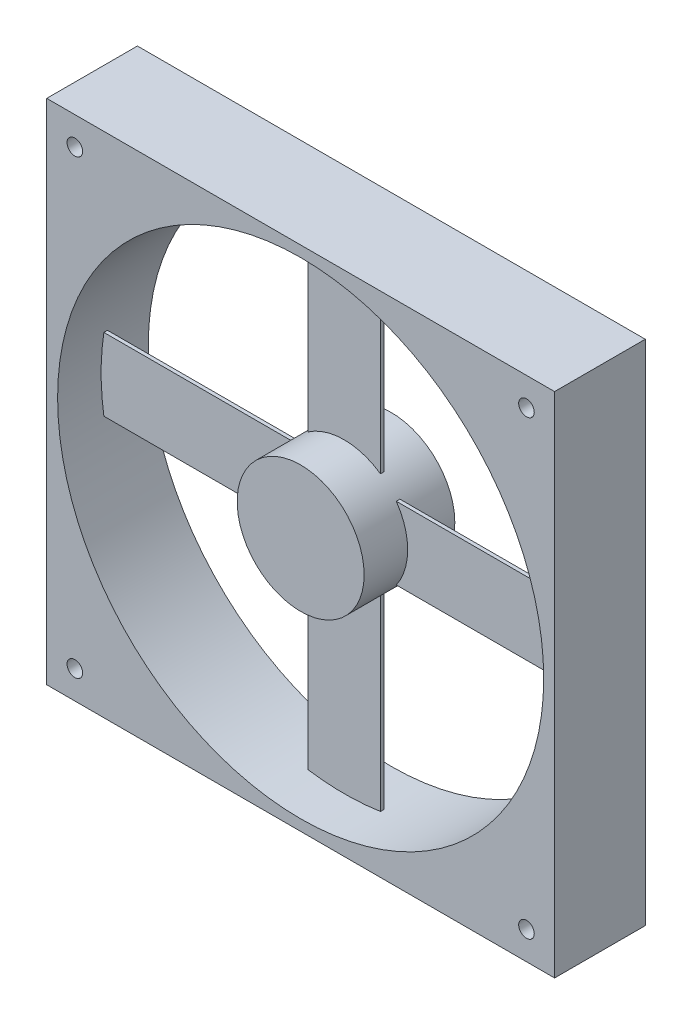
ISO-10303-21;
HEADER;
FILE_DESCRIPTION(('STEP AP214'),'2;1');
FILE_NAME('part.step','',(''),(''),'','','');
FILE_SCHEMA(('AUTOMOTIVE_DESIGN { 1 0 10303 214 1 1 1 1 }'));
ENDSEC;
DATA;
#1=APPLICATION_CONTEXT('core data for automotive mechanical design processes');
#2=APPLICATION_PROTOCOL_DEFINITION('international standard','automotive_design',2000,#1);
#3=PRODUCT_CONTEXT('',#1,'mechanical');
#4=PRODUCT('Part','Part','',(#3));
#5=PRODUCT_RELATED_PRODUCT_CATEGORY('part','',(#4));
#6=PRODUCT_DEFINITION_FORMATION('','',#4);
#7=PRODUCT_DEFINITION_CONTEXT('part definition',#1,'design');
#8=PRODUCT_DEFINITION('design','',#6,#7);
#9=PRODUCT_DEFINITION_SHAPE('','',#8);
#10=(LENGTH_UNIT() NAMED_UNIT(*) SI_UNIT(.MILLI.,.METRE.));
#11=(NAMED_UNIT(*) PLANE_ANGLE_UNIT() SI_UNIT($,.RADIAN.));
#12=(NAMED_UNIT(*) SI_UNIT($,.STERADIAN.) SOLID_ANGLE_UNIT());
#13=UNCERTAINTY_MEASURE_WITH_UNIT(LENGTH_MEASURE(1.E-05),#10,'distance_accuracy_value','');
#14=(GEOMETRIC_REPRESENTATION_CONTEXT(3) GLOBAL_UNCERTAINTY_ASSIGNED_CONTEXT((#13)) GLOBAL_UNIT_ASSIGNED_CONTEXT((#10,
#11,#12)) REPRESENTATION_CONTEXT('',''));
#15=CARTESIAN_POINT('',(0.,0.,0.));
#16=DIRECTION('',(0.,0.,1.));
#17=DIRECTION('',(1.,0.,0.));
#18=AXIS2_PLACEMENT_3D('',#15,#16,#17);
#19=CARTESIAN_POINT('',(0.,0.,12.));
#20=DIRECTION('',(0.,0.,-1.));
#21=DIRECTION('',(-1.,0.,0.));
#22=AXIS2_PLACEMENT_3D('',#19,#20,#21);
#23=PLANE('',#22);
#24=CARTESIAN_POINT('',(0.,0.,12.));
#25=DIRECTION('',(0.,0.,-1.));
#26=DIRECTION('',(-1.,0.,0.));
#27=AXIS2_PLACEMENT_3D('',#24,#25,#26);
#28=CIRCLE('',#27,17.5);
#29=CARTESIAN_POINT('',(-10.,14.3614066163451,12.));
#30=VERTEX_POINT('',#29);
#31=CARTESIAN_POINT('',(10.,14.3614066163451,12.));
#32=VERTEX_POINT('',#31);
#33=EDGE_CURVE('E429',#30,#32,#28,.T.);
#34=ORIENTED_EDGE('',*,*,#33,.F.);
#35=DIRECTION('',(0.,1.,0.));
#36=VECTOR('',#35,1.);
#37=CARTESIAN_POINT('',(-10.,66.2495283002075,12.));
#38=LINE('',#37,#36);
#39=CARTESIAN_POINT('',(-10.,66.2495283002075,12.));
#40=VERTEX_POINT('',#39);
#41=EDGE_CURVE('E418',#30,#40,#38,.T.);
#42=ORIENTED_EDGE('',*,*,#41,.T.);
#43=CARTESIAN_POINT('',(0.,0.,12.));
#44=DIRECTION('',(0.,0.,-1.));
#45=DIRECTION('',(-1.,0.,0.));
#46=AXIS2_PLACEMENT_3D('',#43,#44,#45);
#47=CIRCLE('',#46,67.);
#48=CARTESIAN_POINT('',(10.,66.2495283002075,12.));
#49=VERTEX_POINT('',#48);
#50=EDGE_CURVE('E421',#40,#49,#47,.T.);
#51=ORIENTED_EDGE('',*,*,#50,.T.);
#52=DIRECTION('',(0.,-1.,0.));
#53=VECTOR('',#52,1.);
#54=CARTESIAN_POINT('',(10.,66.2495283002075,12.));
#55=LINE('',#54,#53);
#56=EDGE_CURVE('E216',#49,#32,#55,.T.);
#57=ORIENTED_EDGE('',*,*,#56,.T.);
#58=EDGE_LOOP('',(#34,#42,#51,#57));
#59=FACE_BOUND('',#58,.T.);
#60=ADVANCED_FACE('F32',(#59),#23,.T.);
#61=CARTESIAN_POINT('',(14.3614066163451,10.,12.));
#62=VERTEX_POINT('',#61);
#63=CARTESIAN_POINT('',(14.3614066163451,-10.,12.));
#64=VERTEX_POINT('',#63);
#65=EDGE_CURVE('E396',#62,#64,#28,.T.);
#66=ORIENTED_EDGE('',*,*,#65,.F.);
#67=DIRECTION('',(1.,0.,0.));
#68=VECTOR('',#67,1.);
#69=CARTESIAN_POINT('',(66.2495283002075,10.,12.));
#70=LINE('',#69,#68);
#71=CARTESIAN_POINT('',(66.2495283002075,10.,12.));
#72=VERTEX_POINT('',#71);
#73=EDGE_CURVE('E211',#62,#72,#70,.T.);
#74=ORIENTED_EDGE('',*,*,#73,.T.);
#75=CARTESIAN_POINT('',(0.,0.,12.));
#76=DIRECTION('',(0.,0.,-1.));
#77=DIRECTION('',(-1.,0.,0.));
#78=AXIS2_PLACEMENT_3D('',#75,#76,#77);
#79=CIRCLE('',#78,67.);
#80=CARTESIAN_POINT('',(66.2495283002075,-10.,12.));
#81=VERTEX_POINT('',#80);
#82=EDGE_CURVE('E406',#72,#81,#79,.T.);
#83=ORIENTED_EDGE('',*,*,#82,.T.);
#84=DIRECTION('',(-1.,0.,0.));
#85=VECTOR('',#84,1.);
#86=CARTESIAN_POINT('',(66.2495283002075,-10.,12.));
#87=LINE('',#86,#85);
#88=EDGE_CURVE('E403',#81,#64,#87,.T.);
#89=ORIENTED_EDGE('',*,*,#88,.T.);
#90=EDGE_LOOP('',(#66,#74,#83,#89));
#91=FACE_BOUND('',#90,.T.);
#92=ADVANCED_FACE('F355',(#91),#23,.T.);
#93=CARTESIAN_POINT('',(9.99999999999999,-14.3614066163451,12.));
#94=VERTEX_POINT('',#93);
#95=CARTESIAN_POINT('',(-10.,-14.3614066163451,12.));
#96=VERTEX_POINT('',#95);
#97=EDGE_CURVE('E387',#94,#96,#28,.T.);
#98=ORIENTED_EDGE('',*,*,#97,.F.);
#99=DIRECTION('',(0.,-1.,0.));
#100=VECTOR('',#99,1.);
#101=CARTESIAN_POINT('',(10.,-14.3614066163451,12.));
#102=LINE('',#101,#100);
#103=CARTESIAN_POINT('',(10.,-66.2495283002075,12.));
#104=VERTEX_POINT('',#103);
#105=EDGE_CURVE('E390',#94,#104,#102,.T.);
#106=ORIENTED_EDGE('',*,*,#105,.T.);
#107=CARTESIAN_POINT('',(0.,0.,12.));
#108=DIRECTION('',(0.,0.,-1.));
#109=DIRECTION('',(-1.,0.,0.));
#110=AXIS2_PLACEMENT_3D('',#107,#108,#109);
#111=CIRCLE('',#110,67.);
#112=CARTESIAN_POINT('',(-10.,-66.2495283002075,12.));
#113=VERTEX_POINT('',#112);
#114=EDGE_CURVE('E48',#104,#113,#111,.T.);
#115=ORIENTED_EDGE('',*,*,#114,.T.);
#116=DIRECTION('',(0.,1.,0.));
#117=VECTOR('',#116,1.);
#118=CARTESIAN_POINT('',(-10.,-14.3614066163451,12.));
#119=LINE('',#118,#117);
#120=EDGE_CURVE('E393',#113,#96,#119,.T.);
#121=ORIENTED_EDGE('',*,*,#120,.T.);
#122=EDGE_LOOP('',(#98,#106,#115,#121));
#123=FACE_BOUND('',#122,.T.);
#124=ADVANCED_FACE('F362',(#123),#23,.T.);
#125=CARTESIAN_POINT('',(0.,0.,13.));
#126=DIRECTION('',(0.,0.,-1.));
#127=DIRECTION('',(-1.,0.,0.));
#128=AXIS2_PLACEMENT_3D('',#125,#126,#127);
#129=PLANE('',#128);
#130=DIRECTION('',(0.,1.,0.));
#131=VECTOR('',#130,1.);
#132=CARTESIAN_POINT('',(-10.,66.2495283002075,13.));
#133=LINE('',#132,#131);
#134=CARTESIAN_POINT('',(-10.,14.3614066163451,13.));
#135=VERTEX_POINT('',#134);
#136=CARTESIAN_POINT('',(-10.,66.2495283002075,13.));
#137=VERTEX_POINT('',#136);
#138=EDGE_CURVE('E203',#135,#137,#133,.T.);
#139=ORIENTED_EDGE('',*,*,#138,.F.);
#140=CARTESIAN_POINT('',(0.,0.,13.));
#141=DIRECTION('',(0.,0.,-1.));
#142=DIRECTION('',(-1.,0.,0.));
#143=AXIS2_PLACEMENT_3D('',#140,#141,#142);
#144=CIRCLE('',#143,17.5);
#145=CARTESIAN_POINT('',(10.,14.3614066163451,13.));
#146=VERTEX_POINT('',#145);
#147=EDGE_CURVE('E11',#135,#146,#144,.T.);
#148=ORIENTED_EDGE('',*,*,#147,.T.);
#149=DIRECTION('',(0.,-1.,0.));
#150=VECTOR('',#149,1.);
#151=CARTESIAN_POINT('',(10.,66.2495283002075,13.));
#152=LINE('',#151,#150);
#153=CARTESIAN_POINT('',(10.,66.2495283002075,13.));
#154=VERTEX_POINT('',#153);
#155=EDGE_CURVE('E208',#154,#146,#152,.T.);
#156=ORIENTED_EDGE('',*,*,#155,.F.);
#157=CARTESIAN_POINT('',(0.,0.,13.));
#158=DIRECTION('',(0.,0.,-1.));
#159=DIRECTION('',(-1.,0.,0.));
#160=AXIS2_PLACEMENT_3D('',#157,#158,#159);
#161=CIRCLE('',#160,67.);
#162=EDGE_CURVE('E206',#137,#154,#161,.T.);
#163=ORIENTED_EDGE('',*,*,#162,.F.);
#164=EDGE_LOOP('',(#139,#148,#156,#163));
#165=FACE_BOUND('',#164,.T.);
#166=ADVANCED_FACE('F374',(#165),#129,.F.);
#167=DIRECTION('',(1.,0.,0.));
#168=VECTOR('',#167,1.);
#169=CARTESIAN_POINT('',(66.2495283002075,10.,13.));
#170=LINE('',#169,#168);
#171=CARTESIAN_POINT('',(14.3614066163451,10.,13.));
#172=VERTEX_POINT('',#171);
#173=CARTESIAN_POINT('',(66.2495283002075,10.,13.));
#174=VERTEX_POINT('',#173);
#175=EDGE_CURVE('E425',#172,#174,#170,.T.);
#176=ORIENTED_EDGE('',*,*,#175,.F.);
#177=CARTESIAN_POINT('',(14.3614066163451,-10.,13.));
#178=VERTEX_POINT('',#177);
#179=EDGE_CURVE('E41',#172,#178,#144,.T.);
#180=ORIENTED_EDGE('',*,*,#179,.T.);
#181=DIRECTION('',(-1.,0.,0.));
#182=VECTOR('',#181,1.);
#183=CARTESIAN_POINT('',(66.2495283002075,-10.,13.));
#184=LINE('',#183,#182);
#185=CARTESIAN_POINT('',(66.2495283002075,-10.,13.));
#186=VERTEX_POINT('',#185);
#187=EDGE_CURVE('E431',#186,#178,#184,.T.);
#188=ORIENTED_EDGE('',*,*,#187,.F.);
#189=CARTESIAN_POINT('',(0.,0.,13.));
#190=DIRECTION('',(0.,0.,-1.));
#191=DIRECTION('',(-1.,0.,0.));
#192=AXIS2_PLACEMENT_3D('',#189,#190,#191);
#193=CIRCLE('',#192,67.);
#194=EDGE_CURVE('E428',#174,#186,#193,.T.);
#195=ORIENTED_EDGE('',*,*,#194,.F.);
#196=EDGE_LOOP('',(#176,#180,#188,#195));
#197=FACE_BOUND('',#196,.T.);
#198=ADVANCED_FACE('F384',(#197),#129,.F.);
#199=DIRECTION('',(0.,-1.,0.));
#200=VECTOR('',#199,1.);
#201=CARTESIAN_POINT('',(10.,-14.3614066163451,13.));
#202=LINE('',#201,#200);
#203=CARTESIAN_POINT('',(10.,-14.3614066163451,13.));
#204=VERTEX_POINT('',#203);
#205=CARTESIAN_POINT('',(10.,-66.2495283002075,13.));
#206=VERTEX_POINT('',#205);
#207=EDGE_CURVE('E434',#204,#206,#202,.T.);
#208=ORIENTED_EDGE('',*,*,#207,.F.);
#209=CARTESIAN_POINT('',(-10.,-14.3614066163451,13.));
#210=VERTEX_POINT('',#209);
#211=EDGE_CURVE('E178',#204,#210,#144,.T.);
#212=ORIENTED_EDGE('',*,*,#211,.T.);
#213=DIRECTION('',(0.,1.,0.));
#214=VECTOR('',#213,1.);
#215=CARTESIAN_POINT('',(-10.,-14.3614066163451,13.));
#216=LINE('',#215,#214);
#217=CARTESIAN_POINT('',(-10.,-66.2495283002075,13.));
#218=VERTEX_POINT('',#217);
#219=EDGE_CURVE('E193',#218,#210,#216,.T.);
#220=ORIENTED_EDGE('',*,*,#219,.F.);
#221=CARTESIAN_POINT('',(0.,0.,13.));
#222=DIRECTION('',(0.,0.,-1.));
#223=DIRECTION('',(-1.,0.,0.));
#224=AXIS2_PLACEMENT_3D('',#221,#222,#223);
#225=CIRCLE('',#224,67.);
#226=EDGE_CURVE('E198',#206,#218,#225,.T.);
#227=ORIENTED_EDGE('',*,*,#226,.F.);
#228=EDGE_LOOP('',(#208,#212,#220,#227));
#229=FACE_BOUND('',#228,.T.);
#230=ADVANCED_FACE('F375',(#229),#129,.F.);
#231=CARTESIAN_POINT('',(-70.,70.,25.));
#232=DIRECTION('',(1.,0.,0.));
#233=DIRECTION('',(0.,1.,0.));
#234=AXIS2_PLACEMENT_3D('',#231,#232,#233);
#235=PLANE('',#234);
#236=DIRECTION('',(0.,-1.,0.));
#237=VECTOR('',#236,1.);
#238=CARTESIAN_POINT('',(-70.,70.,0.));
#239=LINE('',#238,#237);
#240=CARTESIAN_POINT('',(-70.,70.,0.));
#241=VERTEX_POINT('',#240);
#242=CARTESIAN_POINT('',(-70.,-70.,0.));
#243=VERTEX_POINT('',#242);
#244=EDGE_CURVE('E248',#241,#243,#239,.T.);
#245=ORIENTED_EDGE('',*,*,#244,.T.);
#246=DIRECTION('',(0.,0.,-1.));
#247=VECTOR('',#246,1.);
#248=CARTESIAN_POINT('',(-70.,-70.,25.));
#249=LINE('',#248,#247);
#250=CARTESIAN_POINT('',(-70.,-70.,25.));
#251=VERTEX_POINT('',#250);
#252=EDGE_CURVE('E249',#251,#243,#249,.T.);
#253=ORIENTED_EDGE('',*,*,#252,.F.);
#254=DIRECTION('',(0.,-1.,0.));
#255=VECTOR('',#254,1.);
#256=CARTESIAN_POINT('',(-70.,70.,25.));
#257=LINE('',#256,#255);
#258=CARTESIAN_POINT('',(-70.,70.,25.));
#259=VERTEX_POINT('',#258);
#260=EDGE_CURVE('E261',#259,#251,#257,.T.);
#261=ORIENTED_EDGE('',*,*,#260,.F.);
#262=DIRECTION('',(0.,0.,-1.));
#263=VECTOR('',#262,1.);
#264=CARTESIAN_POINT('',(-70.,70.,25.));
#265=LINE('',#264,#263);
#266=EDGE_CURVE('E262',#259,#241,#265,.T.);
#267=ORIENTED_EDGE('',*,*,#266,.T.);
#268=EDGE_LOOP('',(#245,#253,#261,#267));
#269=FACE_BOUND('',#268,.T.);
#270=ADVANCED_FACE('F334',(#269),#235,.F.);
#271=CARTESIAN_POINT('',(-70.,-70.,25.));
#272=DIRECTION('',(0.,1.,0.));
#273=DIRECTION('',(0.,0.,1.));
#274=AXIS2_PLACEMENT_3D('',#271,#272,#273);
#275=PLANE('',#274);
#276=DIRECTION('',(1.,0.,0.));
#277=VECTOR('',#276,1.);
#278=CARTESIAN_POINT('',(-70.,-70.,0.));
#279=LINE('',#278,#277);
#280=CARTESIAN_POINT('',(70.,-70.,0.));
#281=VERTEX_POINT('',#280);
#282=EDGE_CURVE('E253',#243,#281,#279,.T.);
#283=ORIENTED_EDGE('',*,*,#282,.T.);
#284=DIRECTION('',(0.,0.,-1.));
#285=VECTOR('',#284,1.);
#286=CARTESIAN_POINT('',(70.,-70.,25.));
#287=LINE('',#286,#285);
#288=CARTESIAN_POINT('',(70.,-70.,25.));
#289=VERTEX_POINT('',#288);
#290=EDGE_CURVE('E254',#289,#281,#287,.T.);
#291=ORIENTED_EDGE('',*,*,#290,.F.);
#292=DIRECTION('',(1.,0.,0.));
#293=VECTOR('',#292,1.);
#294=CARTESIAN_POINT('',(-70.,-70.,25.));
#295=LINE('',#294,#293);
#296=EDGE_CURVE('E275',#251,#289,#295,.T.);
#297=ORIENTED_EDGE('',*,*,#296,.F.);
#298=ORIENTED_EDGE('',*,*,#252,.T.);
#299=EDGE_LOOP('',(#283,#291,#297,#298));
#300=FACE_BOUND('',#299,.T.);
#301=ADVANCED_FACE('F337',(#300),#275,.F.);
#302=CARTESIAN_POINT('',(70.,70.,25.));
#303=DIRECTION('',(-1.,0.,0.));
#304=DIRECTION('',(0.,-1.,0.));
#305=AXIS2_PLACEMENT_3D('',#302,#303,#304);
#306=PLANE('',#305);
#307=DIRECTION('',(0.,1.,0.));
#308=VECTOR('',#307,1.);
#309=CARTESIAN_POINT('',(70.,70.,0.));
#310=LINE('',#309,#308);
#311=CARTESIAN_POINT('',(70.,70.,0.));
#312=VERTEX_POINT('',#311);
#313=EDGE_CURVE('E252',#281,#312,#310,.T.);
#314=ORIENTED_EDGE('',*,*,#313,.T.);
#315=DIRECTION('',(0.,0.,-1.));
#316=VECTOR('',#315,1.);
#317=CARTESIAN_POINT('',(70.,70.,25.));
#318=LINE('',#317,#316);
#319=CARTESIAN_POINT('',(70.,70.,25.));
#320=VERTEX_POINT('',#319);
#321=EDGE_CURVE('E258',#320,#312,#318,.T.);
#322=ORIENTED_EDGE('',*,*,#321,.F.);
#323=DIRECTION('',(0.,1.,0.));
#324=VECTOR('',#323,1.);
#325=CARTESIAN_POINT('',(70.,70.,25.));
#326=LINE('',#325,#324);
#327=EDGE_CURVE('E273',#289,#320,#326,.T.);
#328=ORIENTED_EDGE('',*,*,#327,.F.);
#329=ORIENTED_EDGE('',*,*,#290,.T.);
#330=EDGE_LOOP('',(#314,#322,#328,#329));
#331=FACE_BOUND('',#330,.T.);
#332=ADVANCED_FACE('F342',(#331),#306,.F.);
#333=CARTESIAN_POINT('',(-70.,70.,25.));
#334=DIRECTION('',(0.,-1.,0.));
#335=DIRECTION('',(0.,0.,-1.));
#336=AXIS2_PLACEMENT_3D('',#333,#334,#335);
#337=PLANE('',#336);
#338=DIRECTION('',(-1.,0.,0.));
#339=VECTOR('',#338,1.);
#340=CARTESIAN_POINT('',(-70.,70.,0.));
#341=LINE('',#340,#339);
#342=EDGE_CURVE('E257',#312,#241,#341,.T.);
#343=ORIENTED_EDGE('',*,*,#342,.T.);
#344=ORIENTED_EDGE('',*,*,#266,.F.);
#345=DIRECTION('',(-1.,0.,0.));
#346=VECTOR('',#345,1.);
#347=CARTESIAN_POINT('',(-70.,70.,25.));
#348=LINE('',#347,#346);
#349=EDGE_CURVE('E270',#320,#259,#348,.T.);
#350=ORIENTED_EDGE('',*,*,#349,.F.);
#351=ORIENTED_EDGE('',*,*,#321,.T.);
#352=EDGE_LOOP('',(#343,#344,#350,#351));
#353=FACE_BOUND('',#352,.T.);
#354=ADVANCED_FACE('F319',(#353),#337,.F.);
#355=CARTESIAN_POINT('',(-70.,-70.,25.));
#356=DIRECTION('',(0.,0.,1.));
#357=DIRECTION('',(1.,0.,0.));
#358=AXIS2_PLACEMENT_3D('',#355,#356,#357);
#359=PLANE('',#358);
#360=CARTESIAN_POINT('',(0.,0.,25.));
#361=DIRECTION('',(0.,0.,1.));
#362=DIRECTION('',(1.,0.,0.));
#363=AXIS2_PLACEMENT_3D('',#360,#361,#362);
#364=CIRCLE('',#363,67.);
#365=CARTESIAN_POINT('',(67.,0.,25.));
#366=VERTEX_POINT('',#365);
#367=EDGE_CURVE('E179',#366,#366,#364,.T.);
#368=ORIENTED_EDGE('',*,*,#367,.F.);
#369=EDGE_LOOP('',(#368));
#370=FACE_BOUND('',#369,.T.);
#371=CARTESIAN_POINT('',(62.2499999999998,62.25,25.));
#372=DIRECTION('',(0.,0.,1.));
#373=DIRECTION('',(1.,0.,0.));
#374=AXIS2_PLACEMENT_3D('',#371,#372,#373);
#375=CIRCLE('',#374,2.15000000000001);
#376=CARTESIAN_POINT('',(64.3999999999998,62.25,25.));
#377=VERTEX_POINT('',#376);
#378=EDGE_CURVE('E295',#377,#377,#375,.T.);
#379=ORIENTED_EDGE('',*,*,#378,.F.);
#380=EDGE_LOOP('',(#379));
#381=FACE_BOUND('',#380,.T.);
#382=CARTESIAN_POINT('',(62.2499999999998,-62.25,25.));
#383=DIRECTION('',(0.,0.,1.));
#384=DIRECTION('',(1.,0.,0.));
#385=AXIS2_PLACEMENT_3D('',#382,#383,#384);
#386=CIRCLE('',#385,2.15000000000001);
#387=CARTESIAN_POINT('',(64.3999999999998,-62.25,25.));
#388=VERTEX_POINT('',#387);
#389=EDGE_CURVE('E289',#388,#388,#386,.T.);
#390=ORIENTED_EDGE('',*,*,#389,.F.);
#391=EDGE_LOOP('',(#390));
#392=FACE_BOUND('',#391,.T.);
#393=CARTESIAN_POINT('',(-62.2499999999998,-62.25,25.));
#394=DIRECTION('',(0.,0.,1.));
#395=DIRECTION('',(1.,0.,0.));
#396=AXIS2_PLACEMENT_3D('',#393,#394,#395);
#397=CIRCLE('',#396,2.15);
#398=CARTESIAN_POINT('',(-60.0999999999998,-62.25,25.));
#399=VERTEX_POINT('',#398);
#400=EDGE_CURVE('E282',#399,#399,#397,.T.);
#401=ORIENTED_EDGE('',*,*,#400,.F.);
#402=EDGE_LOOP('',(#401));
#403=FACE_BOUND('',#402,.T.);
#404=CARTESIAN_POINT('',(-62.2499999999998,62.25,25.));
#405=DIRECTION('',(0.,0.,1.));
#406=DIRECTION('',(1.,0.,0.));
#407=AXIS2_PLACEMENT_3D('',#404,#405,#406);
#408=CIRCLE('',#407,2.15);
#409=CARTESIAN_POINT('',(-60.0999999999998,62.25,25.));
#410=VERTEX_POINT('',#409);
#411=EDGE_CURVE('E279',#410,#410,#408,.T.);
#412=ORIENTED_EDGE('',*,*,#411,.F.);
#413=EDGE_LOOP('',(#412));
#414=FACE_BOUND('',#413,.T.);
#415=ORIENTED_EDGE('',*,*,#260,.T.);
#416=ORIENTED_EDGE('',*,*,#296,.T.);
#417=ORIENTED_EDGE('',*,*,#327,.T.);
#418=ORIENTED_EDGE('',*,*,#349,.T.);
#419=EDGE_LOOP('',(#415,#416,#417,#418));
#420=FACE_BOUND('',#419,.T.);
#421=ADVANCED_FACE('F34',(#370,#381,#392,#403,#414,#420),#359,.T.);
#422=CARTESIAN_POINT('',(-70.,-70.,0.));
#423=DIRECTION('',(0.,0.,1.));
#424=DIRECTION('',(1.,0.,0.));
#425=AXIS2_PLACEMENT_3D('',#422,#423,#424);
#426=PLANE('',#425);
#427=CARTESIAN_POINT('',(0.,0.,0.));
#428=DIRECTION('',(0.,0.,1.));
#429=DIRECTION('',(1.,0.,0.));
#430=AXIS2_PLACEMENT_3D('',#427,#428,#429);
#431=CIRCLE('',#430,67.);
#432=CARTESIAN_POINT('',(67.,0.,0.));
#433=VERTEX_POINT('',#432);
#434=EDGE_CURVE('E272',#433,#433,#431,.T.);
#435=ORIENTED_EDGE('',*,*,#434,.T.);
#436=EDGE_LOOP('',(#435));
#437=FACE_BOUND('',#436,.T.);
#438=CARTESIAN_POINT('',(62.2499999999998,62.25,0.));
#439=DIRECTION('',(0.,0.,1.));
#440=DIRECTION('',(1.,0.,0.));
#441=AXIS2_PLACEMENT_3D('',#438,#439,#440);
#442=CIRCLE('',#441,2.15000000000001);
#443=CARTESIAN_POINT('',(64.3999999999998,62.25,0.));
#444=VERTEX_POINT('',#443);
#445=EDGE_CURVE('E298',#444,#444,#442,.T.);
#446=ORIENTED_EDGE('',*,*,#445,.T.);
#447=EDGE_LOOP('',(#446));
#448=FACE_BOUND('',#447,.T.);
#449=CARTESIAN_POINT('',(62.2499999999998,-62.25,0.));
#450=DIRECTION('',(0.,0.,1.));
#451=DIRECTION('',(1.,0.,0.));
#452=AXIS2_PLACEMENT_3D('',#449,#450,#451);
#453=CIRCLE('',#452,2.15000000000001);
#454=CARTESIAN_POINT('',(64.3999999999998,-62.25,0.));
#455=VERTEX_POINT('',#454);
#456=EDGE_CURVE('E292',#455,#455,#453,.T.);
#457=ORIENTED_EDGE('',*,*,#456,.T.);
#458=EDGE_LOOP('',(#457));
#459=FACE_BOUND('',#458,.T.);
#460=CARTESIAN_POINT('',(-62.2499999999998,-62.25,0.));
#461=DIRECTION('',(0.,0.,1.));
#462=DIRECTION('',(1.,0.,0.));
#463=AXIS2_PLACEMENT_3D('',#460,#461,#462);
#464=CIRCLE('',#463,2.15);
#465=CARTESIAN_POINT('',(-60.0999999999998,-62.25,0.));
#466=VERTEX_POINT('',#465);
#467=EDGE_CURVE('E286',#466,#466,#464,.T.);
#468=ORIENTED_EDGE('',*,*,#467,.T.);
#469=EDGE_LOOP('',(#468));
#470=FACE_BOUND('',#469,.T.);
#471=CARTESIAN_POINT('',(-62.2499999999998,62.25,0.));
#472=DIRECTION('',(0.,0.,1.));
#473=DIRECTION('',(1.,0.,0.));
#474=AXIS2_PLACEMENT_3D('',#471,#472,#473);
#475=CIRCLE('',#474,2.15);
#476=CARTESIAN_POINT('',(-60.0999999999998,62.25,0.));
#477=VERTEX_POINT('',#476);
#478=EDGE_CURVE('E283',#477,#477,#475,.T.);
#479=ORIENTED_EDGE('',*,*,#478,.T.);
#480=EDGE_LOOP('',(#479));
#481=FACE_BOUND('',#480,.T.);
#482=ORIENTED_EDGE('',*,*,#244,.F.);
#483=ORIENTED_EDGE('',*,*,#342,.F.);
#484=ORIENTED_EDGE('',*,*,#313,.F.);
#485=ORIENTED_EDGE('',*,*,#282,.F.);
#486=EDGE_LOOP('',(#482,#483,#484,#485));
#487=FACE_BOUND('',#486,.T.);
#488=ADVANCED_FACE('F307',(#437,#448,#459,#470,#481,#487),#426,.F.);
#489=CARTESIAN_POINT('',(-62.2499999999998,62.25,0.));
#490=DIRECTION('',(0.,0.,1.));
#491=DIRECTION('',(1.,0.,0.));
#492=AXIS2_PLACEMENT_3D('',#489,#490,#491);
#493=CYLINDRICAL_SURFACE('',#492,2.15);
#494=ORIENTED_EDGE('',*,*,#478,.F.);
#495=EDGE_LOOP('',(#494));
#496=FACE_BOUND('',#495,.T.);
#497=ORIENTED_EDGE('',*,*,#411,.T.);
#498=EDGE_LOOP('',(#497));
#499=FACE_BOUND('',#498,.T.);
#500=ADVANCED_FACE('F347',(#496,#499),#493,.F.);
#501=CARTESIAN_POINT('',(-62.2499999999998,-62.25,0.));
#502=DIRECTION('',(0.,0.,1.));
#503=DIRECTION('',(1.,0.,0.));
#504=AXIS2_PLACEMENT_3D('',#501,#502,#503);
#505=CYLINDRICAL_SURFACE('',#504,2.15);
#506=ORIENTED_EDGE('',*,*,#467,.F.);
#507=EDGE_LOOP('',(#506));
#508=FACE_BOUND('',#507,.T.);
#509=ORIENTED_EDGE('',*,*,#400,.T.);
#510=EDGE_LOOP('',(#509));
#511=FACE_BOUND('',#510,.T.);
#512=ADVANCED_FACE('F351',(#508,#511),#505,.F.);
#513=CARTESIAN_POINT('',(62.2499999999998,-62.25,0.));
#514=DIRECTION('',(0.,0.,1.));
#515=DIRECTION('',(1.,0.,0.));
#516=AXIS2_PLACEMENT_3D('',#513,#514,#515);
#517=CYLINDRICAL_SURFACE('',#516,2.15000000000001);
#518=ORIENTED_EDGE('',*,*,#456,.F.);
#519=EDGE_LOOP('',(#518));
#520=FACE_BOUND('',#519,.T.);
#521=ORIENTED_EDGE('',*,*,#389,.T.);
#522=EDGE_LOOP('',(#521));
#523=FACE_BOUND('',#522,.T.);
#524=ADVANCED_FACE('F486',(#520,#523),#517,.F.);
#525=CARTESIAN_POINT('',(62.2499999999998,62.25,0.));
#526=DIRECTION('',(0.,0.,1.));
#527=DIRECTION('',(1.,0.,0.));
#528=AXIS2_PLACEMENT_3D('',#525,#526,#527);
#529=CYLINDRICAL_SURFACE('',#528,2.15000000000001);
#530=ORIENTED_EDGE('',*,*,#445,.F.);
#531=EDGE_LOOP('',(#530));
#532=FACE_BOUND('',#531,.T.);
#533=ORIENTED_EDGE('',*,*,#378,.T.);
#534=EDGE_LOOP('',(#533));
#535=FACE_BOUND('',#534,.T.);
#536=ADVANCED_FACE('F313',(#532,#535),#529,.F.);
#537=CARTESIAN_POINT('',(0.,0.,0.));
#538=DIRECTION('',(0.,0.,1.));
#539=DIRECTION('',(1.,0.,0.));
#540=AXIS2_PLACEMENT_3D('',#537,#538,#539);
#541=CYLINDRICAL_SURFACE('',#540,67.);
#542=DIRECTION('',(0.,0.,1.));
#543=VECTOR('',#542,1.);
#544=CARTESIAN_POINT('',(-9.99999999999999,-66.2495283002075,12.));
#545=LINE('',#544,#543);
#546=EDGE_CURVE('E53',#113,#218,#545,.T.);
#547=ORIENTED_EDGE('',*,*,#546,.F.);
#548=ORIENTED_EDGE('',*,*,#114,.F.);
#549=DIRECTION('',(0.,0.,1.));
#550=VECTOR('',#549,1.);
#551=CARTESIAN_POINT('',(10.,-66.2495283002075,12.));
#552=LINE('',#551,#550);
#553=EDGE_CURVE('E232',#104,#206,#552,.T.);
#554=ORIENTED_EDGE('',*,*,#553,.T.);
#555=ORIENTED_EDGE('',*,*,#226,.T.);
#556=EDGE_LOOP('',(#547,#548,#554,#555));
#557=FACE_BOUND('',#556,.T.);
#558=DIRECTION('',(0.,0.,1.));
#559=VECTOR('',#558,1.);
#560=CARTESIAN_POINT('',(66.2495283002075,-10.,12.));
#561=LINE('',#560,#559);
#562=EDGE_CURVE('E240',#81,#186,#561,.T.);
#563=ORIENTED_EDGE('',*,*,#562,.F.);
#564=ORIENTED_EDGE('',*,*,#82,.F.);
#565=DIRECTION('',(0.,0.,1.));
#566=VECTOR('',#565,1.);
#567=CARTESIAN_POINT('',(66.2495283002075,10.,12.));
#568=LINE('',#567,#566);
#569=EDGE_CURVE('E243',#72,#174,#568,.T.);
#570=ORIENTED_EDGE('',*,*,#569,.T.);
#571=ORIENTED_EDGE('',*,*,#194,.T.);
#572=EDGE_LOOP('',(#563,#564,#570,#571));
#573=FACE_BOUND('',#572,.T.);
#574=DIRECTION('',(0.,0.,1.));
#575=VECTOR('',#574,1.);
#576=CARTESIAN_POINT('',(10.,66.2495283002075,12.));
#577=LINE('',#576,#575);
#578=EDGE_CURVE('E215',#49,#154,#577,.T.);
#579=ORIENTED_EDGE('',*,*,#578,.F.);
#580=ORIENTED_EDGE('',*,*,#50,.F.);
#581=DIRECTION('',(0.,0.,1.));
#582=VECTOR('',#581,1.);
#583=CARTESIAN_POINT('',(-10.,66.2495283002075,12.));
#584=LINE('',#583,#582);
#585=EDGE_CURVE('E219',#40,#137,#584,.T.);
#586=ORIENTED_EDGE('',*,*,#585,.T.);
#587=ORIENTED_EDGE('',*,*,#162,.T.);
#588=EDGE_LOOP('',(#579,#580,#586,#587));
#589=FACE_BOUND('',#588,.T.);
#590=DIRECTION('',(0.,0.,1.));
#591=VECTOR('',#590,1.);
#592=CARTESIAN_POINT('',(-66.2495283002075,10.,12.));
#593=LINE('',#592,#591);
#594=CARTESIAN_POINT('',(-66.2495283002075,10.,12.));
#595=VERTEX_POINT('',#594);
#596=CARTESIAN_POINT('',(-66.2495283002075,10.,13.));
#597=VERTEX_POINT('',#596);
#598=EDGE_CURVE('E225',#595,#597,#593,.T.);
#599=ORIENTED_EDGE('',*,*,#598,.F.);
#600=CARTESIAN_POINT('',(0.,0.,12.));
#601=DIRECTION('',(0.,0.,-1.));
#602=DIRECTION('',(-1.,0.,0.));
#603=AXIS2_PLACEMENT_3D('',#600,#601,#602);
#604=CIRCLE('',#603,67.);
#605=CARTESIAN_POINT('',(-66.2495283002075,-10.,12.));
#606=VERTEX_POINT('',#605);
#607=EDGE_CURVE('E412',#606,#595,#604,.T.);
#608=ORIENTED_EDGE('',*,*,#607,.F.);
#609=DIRECTION('',(0.,0.,1.));
#610=VECTOR('',#609,1.);
#611=CARTESIAN_POINT('',(-66.2495283002075,-10.,12.));
#612=LINE('',#611,#610);
#613=CARTESIAN_POINT('',(-66.2495283002075,-10.,13.));
#614=VERTEX_POINT('',#613);
#615=EDGE_CURVE('E189',#606,#614,#612,.T.);
#616=ORIENTED_EDGE('',*,*,#615,.T.);
#617=CARTESIAN_POINT('',(0.,0.,13.));
#618=DIRECTION('',(0.,0.,-1.));
#619=DIRECTION('',(-1.,0.,0.));
#620=AXIS2_PLACEMENT_3D('',#617,#618,#619);
#621=CIRCLE('',#620,67.);
#622=EDGE_CURVE('E192',#614,#597,#621,.T.);
#623=ORIENTED_EDGE('',*,*,#622,.T.);
#624=EDGE_LOOP('',(#599,#608,#616,#623));
#625=FACE_BOUND('',#624,.T.);
#626=ORIENTED_EDGE('',*,*,#434,.F.);
#627=EDGE_LOOP('',(#626));
#628=FACE_BOUND('',#627,.T.);
#629=ORIENTED_EDGE('',*,*,#367,.T.);
#630=EDGE_LOOP('',(#629));
#631=FACE_BOUND('',#630,.T.);
#632=ADVANCED_FACE('F310',(#557,#573,#589,#625,#628,#631),#541,.F.);
#633=CARTESIAN_POINT('',(0.,0.,12.));
#634=DIRECTION('',(0.,0.,1.));
#635=DIRECTION('',(1.,0.,0.));
#636=AXIS2_PLACEMENT_3D('',#633,#634,#635);
#637=CYLINDRICAL_SURFACE('',#636,17.5);
#638=DIRECTION('',(0.,0.,1.));
#639=VECTOR('',#638,1.);
#640=CARTESIAN_POINT('',(-10.,14.3614066163451,12.));
#641=LINE('',#640,#639);
#642=EDGE_CURVE('E221',#30,#135,#641,.T.);
#643=ORIENTED_EDGE('',*,*,#642,.F.);
#644=ORIENTED_EDGE('',*,*,#33,.T.);
#645=DIRECTION('',(0.,0.,1.));
#646=VECTOR('',#645,1.);
#647=CARTESIAN_POINT('',(10.,14.3614066163451,12.));
#648=LINE('',#647,#646);
#649=EDGE_CURVE('E212',#32,#146,#648,.T.);
#650=ORIENTED_EDGE('',*,*,#649,.T.);
#651=ORIENTED_EDGE('',*,*,#147,.F.);
#652=EDGE_LOOP('',(#643,#644,#650,#651));
#653=FACE_BOUND('',#652,.T.);
#654=DIRECTION('',(0.,0.,1.));
#655=VECTOR('',#654,1.);
#656=CARTESIAN_POINT('',(14.3614066163451,10.,12.));
#657=LINE('',#656,#655);
#658=EDGE_CURVE('E245',#62,#172,#657,.T.);
#659=ORIENTED_EDGE('',*,*,#658,.F.);
#660=ORIENTED_EDGE('',*,*,#65,.T.);
#661=DIRECTION('',(0.,0.,1.));
#662=VECTOR('',#661,1.);
#663=CARTESIAN_POINT('',(14.3614066163451,-10.,12.));
#664=LINE('',#663,#662);
#665=EDGE_CURVE('E237',#64,#178,#664,.T.);
#666=ORIENTED_EDGE('',*,*,#665,.T.);
#667=ORIENTED_EDGE('',*,*,#179,.F.);
#668=EDGE_LOOP('',(#659,#660,#666,#667));
#669=FACE_BOUND('',#668,.T.);
#670=DIRECTION('',(0.,0.,1.));
#671=VECTOR('',#670,1.);
#672=CARTESIAN_POINT('',(9.99999999999999,-14.3614066163451,12.));
#673=LINE('',#672,#671);
#674=EDGE_CURVE('E234',#94,#204,#673,.T.);
#675=ORIENTED_EDGE('',*,*,#674,.F.);
#676=ORIENTED_EDGE('',*,*,#97,.T.);
#677=DIRECTION('',(0.,0.,1.));
#678=VECTOR('',#677,1.);
#679=CARTESIAN_POINT('',(-10.,-14.3614066163451,12.));
#680=LINE('',#679,#678);
#681=EDGE_CURVE('E188',#96,#210,#680,.T.);
#682=ORIENTED_EDGE('',*,*,#681,.T.);
#683=ORIENTED_EDGE('',*,*,#211,.F.);
#684=EDGE_LOOP('',(#675,#676,#682,#683));
#685=FACE_BOUND('',#684,.T.);
#686=CARTESIAN_POINT('',(-14.3614066163451,-10.,12.));
#687=VERTEX_POINT('',#686);
#688=CARTESIAN_POINT('',(-14.3614066163451,10.,12.));
#689=VERTEX_POINT('',#688);
#690=EDGE_CURVE('E397',#687,#689,#28,.T.);
#691=ORIENTED_EDGE('',*,*,#690,.T.);
#692=DIRECTION('',(0.,0.,1.));
#693=VECTOR('',#692,1.);
#694=CARTESIAN_POINT('',(-14.3614066163451,10.,12.));
#695=LINE('',#694,#693);
#696=CARTESIAN_POINT('',(-14.3614066163451,10.,13.));
#697=VERTEX_POINT('',#696);
#698=EDGE_CURVE('E173',#689,#697,#695,.T.);
#699=ORIENTED_EDGE('',*,*,#698,.T.);
#700=CARTESIAN_POINT('',(-14.3614066163451,-10.,13.));
#701=VERTEX_POINT('',#700);
#702=EDGE_CURVE('E36',#701,#697,#144,.T.);
#703=ORIENTED_EDGE('',*,*,#702,.F.);
#704=DIRECTION('',(0.,0.,1.));
#705=VECTOR('',#704,1.);
#706=CARTESIAN_POINT('',(-14.3614066163451,-10.,12.));
#707=LINE('',#706,#705);
#708=EDGE_CURVE('E171',#687,#701,#707,.T.);
#709=ORIENTED_EDGE('',*,*,#708,.F.);
#710=EDGE_LOOP('',(#691,#699,#703,#709));
#711=FACE_BOUND('',#710,.T.);
#712=CARTESIAN_POINT('',(0.,0.,25.));
#713=DIRECTION('',(0.,0.,1.));
#714=DIRECTION('',(1.,0.,0.));
#715=AXIS2_PLACEMENT_3D('',#712,#713,#714);
#716=CIRCLE('',#715,17.5);
#717=CARTESIAN_POINT('',(17.5,0.,25.));
#718=VERTEX_POINT('',#717);
#719=EDGE_CURVE('E458',#718,#718,#716,.T.);
#720=ORIENTED_EDGE('',*,*,#719,.F.);
#721=EDGE_LOOP('',(#720));
#722=FACE_BOUND('',#721,.T.);
#723=CARTESIAN_POINT('',(0.,0.,0.));
#724=DIRECTION('',(0.,0.,1.));
#725=DIRECTION('',(1.,0.,0.));
#726=AXIS2_PLACEMENT_3D('',#723,#724,#725);
#727=CIRCLE('',#726,17.5);
#728=CARTESIAN_POINT('',(17.5,0.,0.));
#729=VERTEX_POINT('',#728);
#730=EDGE_CURVE('E457',#729,#729,#727,.T.);
#731=ORIENTED_EDGE('',*,*,#730,.T.);
#732=EDGE_LOOP('',(#731));
#733=FACE_BOUND('',#732,.T.);
#734=ADVANCED_FACE('F169',(#653,#669,#685,#711,#722,#733),#637,.T.);
#735=CARTESIAN_POINT('',(66.2495283002075,10.,12.));
#736=DIRECTION('',(0.,-1.,0.));
#737=DIRECTION('',(0.,0.,-1.));
#738=AXIS2_PLACEMENT_3D('',#735,#736,#737);
#739=PLANE('',#738);
#740=ORIENTED_EDGE('',*,*,#175,.T.);
#741=ORIENTED_EDGE('',*,*,#569,.F.);
#742=ORIENTED_EDGE('',*,*,#73,.F.);
#743=ORIENTED_EDGE('',*,*,#658,.T.);
#744=EDGE_LOOP('',(#740,#741,#742,#743));
#745=FACE_BOUND('',#744,.T.);
#746=ADVANCED_FACE('F464',(#745),#739,.F.);
#747=CARTESIAN_POINT('',(66.2495283002075,-10.,12.));
#748=DIRECTION('',(0.,1.,0.));
#749=DIRECTION('',(-1.,0.,0.));
#750=AXIS2_PLACEMENT_3D('',#747,#748,#749);
#751=PLANE('',#750);
#752=ORIENTED_EDGE('',*,*,#187,.T.);
#753=ORIENTED_EDGE('',*,*,#665,.F.);
#754=ORIENTED_EDGE('',*,*,#88,.F.);
#755=ORIENTED_EDGE('',*,*,#562,.T.);
#756=EDGE_LOOP('',(#752,#753,#754,#755));
#757=FACE_BOUND('',#756,.T.);
#758=ADVANCED_FACE('F449',(#757),#751,.F.);
#759=CARTESIAN_POINT('',(10.,-14.3614066163451,12.));
#760=DIRECTION('',(-1.,0.,0.));
#761=DIRECTION('',(0.,0.,1.));
#762=AXIS2_PLACEMENT_3D('',#759,#760,#761);
#763=PLANE('',#762);
#764=ORIENTED_EDGE('',*,*,#207,.T.);
#765=ORIENTED_EDGE('',*,*,#553,.F.);
#766=ORIENTED_EDGE('',*,*,#105,.F.);
#767=ORIENTED_EDGE('',*,*,#674,.T.);
#768=EDGE_LOOP('',(#764,#765,#766,#767));
#769=FACE_BOUND('',#768,.T.);
#770=ADVANCED_FACE('F402',(#769),#763,.F.);
#771=CARTESIAN_POINT('',(-10.,-14.3614066163451,12.));
#772=DIRECTION('',(1.,0.,0.));
#773=DIRECTION('',(0.,0.,-1.));
#774=AXIS2_PLACEMENT_3D('',#771,#772,#773);
#775=PLANE('',#774);
#776=ORIENTED_EDGE('',*,*,#219,.T.);
#777=ORIENTED_EDGE('',*,*,#681,.F.);
#778=ORIENTED_EDGE('',*,*,#120,.F.);
#779=ORIENTED_EDGE('',*,*,#546,.T.);
#780=EDGE_LOOP('',(#776,#777,#778,#779));
#781=FACE_BOUND('',#780,.T.);
#782=ADVANCED_FACE('F440',(#781),#775,.F.);
#783=CARTESIAN_POINT('',(-14.3614066163451,-10.,12.));
#784=DIRECTION('',(0.,1.,0.));
#785=DIRECTION('',(0.,0.,1.));
#786=AXIS2_PLACEMENT_3D('',#783,#784,#785);
#787=PLANE('',#786);
#788=DIRECTION('',(-1.,0.,0.));
#789=VECTOR('',#788,1.);
#790=CARTESIAN_POINT('',(-14.3614066163451,-10.,13.));
#791=LINE('',#790,#789);
#792=EDGE_CURVE('E184',#701,#614,#791,.T.);
#793=ORIENTED_EDGE('',*,*,#792,.T.);
#794=ORIENTED_EDGE('',*,*,#615,.F.);
#795=DIRECTION('',(-1.,0.,0.));
#796=VECTOR('',#795,1.);
#797=CARTESIAN_POINT('',(-14.3614066163451,-10.,12.));
#798=LINE('',#797,#796);
#799=EDGE_CURVE('E187',#687,#606,#798,.T.);
#800=ORIENTED_EDGE('',*,*,#799,.F.);
#801=ORIENTED_EDGE('',*,*,#708,.T.);
#802=EDGE_LOOP('',(#793,#794,#800,#801));
#803=FACE_BOUND('',#802,.T.);
#804=ADVANCED_FACE('F182',(#803),#787,.F.);
#805=CARTESIAN_POINT('',(-14.3614066163451,10.,12.));
#806=DIRECTION('',(0.,-1.,0.));
#807=DIRECTION('',(0.,0.,-1.));
#808=AXIS2_PLACEMENT_3D('',#805,#806,#807);
#809=PLANE('',#808);
#810=DIRECTION('',(1.,0.,0.));
#811=VECTOR('',#810,1.);
#812=CARTESIAN_POINT('',(-14.3614066163451,10.,13.));
#813=LINE('',#812,#811);
#814=EDGE_CURVE('E195',#597,#697,#813,.T.);
#815=ORIENTED_EDGE('',*,*,#814,.T.);
#816=ORIENTED_EDGE('',*,*,#698,.F.);
#817=DIRECTION('',(1.,0.,0.));
#818=VECTOR('',#817,1.);
#819=CARTESIAN_POINT('',(-14.3614066163451,10.,12.));
#820=LINE('',#819,#818);
#821=EDGE_CURVE('E415',#595,#689,#820,.T.);
#822=ORIENTED_EDGE('',*,*,#821,.F.);
#823=ORIENTED_EDGE('',*,*,#598,.T.);
#824=EDGE_LOOP('',(#815,#816,#822,#823));
#825=FACE_BOUND('',#824,.T.);
#826=ADVANCED_FACE('F552',(#825),#809,.F.);
#827=CARTESIAN_POINT('',(-10.,66.2495283002075,12.));
#828=DIRECTION('',(1.,0.,0.));
#829=DIRECTION('',(0.,0.,-1.));
#830=AXIS2_PLACEMENT_3D('',#827,#828,#829);
#831=PLANE('',#830);
#832=ORIENTED_EDGE('',*,*,#138,.T.);
#833=ORIENTED_EDGE('',*,*,#585,.F.);
#834=ORIENTED_EDGE('',*,*,#41,.F.);
#835=ORIENTED_EDGE('',*,*,#642,.T.);
#836=EDGE_LOOP('',(#832,#833,#834,#835));
#837=FACE_BOUND('',#836,.T.);
#838=ADVANCED_FACE('F376',(#837),#831,.F.);
#839=CARTESIAN_POINT('',(10.,66.2495283002075,12.));
#840=DIRECTION('',(-1.,0.,0.));
#841=DIRECTION('',(0.,0.,1.));
#842=AXIS2_PLACEMENT_3D('',#839,#840,#841);
#843=PLANE('',#842);
#844=ORIENTED_EDGE('',*,*,#155,.T.);
#845=ORIENTED_EDGE('',*,*,#649,.F.);
#846=ORIENTED_EDGE('',*,*,#56,.F.);
#847=ORIENTED_EDGE('',*,*,#578,.T.);
#848=EDGE_LOOP('',(#844,#845,#846,#847));
#849=FACE_BOUND('',#848,.T.);
#850=ADVANCED_FACE('F367',(#849),#843,.F.);
#851=ORIENTED_EDGE('',*,*,#690,.F.);
#852=ORIENTED_EDGE('',*,*,#799,.T.);
#853=ORIENTED_EDGE('',*,*,#607,.T.);
#854=ORIENTED_EDGE('',*,*,#821,.T.);
#855=EDGE_LOOP('',(#851,#852,#853,#854));
#856=FACE_BOUND('',#855,.T.);
#857=ADVANCED_FACE('F358',(#856),#23,.T.);
#858=ORIENTED_EDGE('',*,*,#792,.F.);
#859=ORIENTED_EDGE('',*,*,#702,.T.);
#860=ORIENTED_EDGE('',*,*,#814,.F.);
#861=ORIENTED_EDGE('',*,*,#622,.F.);
#862=EDGE_LOOP('',(#858,#859,#860,#861));
#863=FACE_BOUND('',#862,.T.);
#864=ADVANCED_FACE('F191',(#863),#129,.F.);
#865=CARTESIAN_POINT('',(-70.,-70.,25.));
#866=DIRECTION('',(0.,0.,1.));
#867=DIRECTION('',(1.,0.,0.));
#868=AXIS2_PLACEMENT_3D('',#865,#866,#867);
#869=PLANE('',#868);
#870=ORIENTED_EDGE('',*,*,#719,.T.);
#871=EDGE_LOOP('',(#870));
#872=FACE_BOUND('',#871,.T.);
#873=ADVANCED_FACE('F373',(#872),#869,.T.);
#874=CARTESIAN_POINT('',(-70.,-70.,0.));
#875=DIRECTION('',(0.,0.,1.));
#876=DIRECTION('',(1.,0.,0.));
#877=AXIS2_PLACEMENT_3D('',#874,#875,#876);
#878=PLANE('',#877);
#879=ORIENTED_EDGE('',*,*,#730,.F.);
#880=EDGE_LOOP('',(#879));
#881=FACE_BOUND('',#880,.T.);
#882=ADVANCED_FACE('F595',(#881),#878,.F.);
#883=CLOSED_SHELL('',(#60,#92,#124,#166,#198,#230,#270,#301,#332,#354,#421,#488,#500,#512,#524,
#536,#632,#734,#746,#758,#770,#782,#804,#826,#838,#850,#857,#864,#873,#882));
#884=MANIFOLD_SOLID_BREP('B2',#883);
#885=ADVANCED_BREP_SHAPE_REPRESENTATION('',(#18,#884),#14);
#886=SHAPE_DEFINITION_REPRESENTATION(#9,#885);
ENDSEC;
END-ISO-10303-21;
